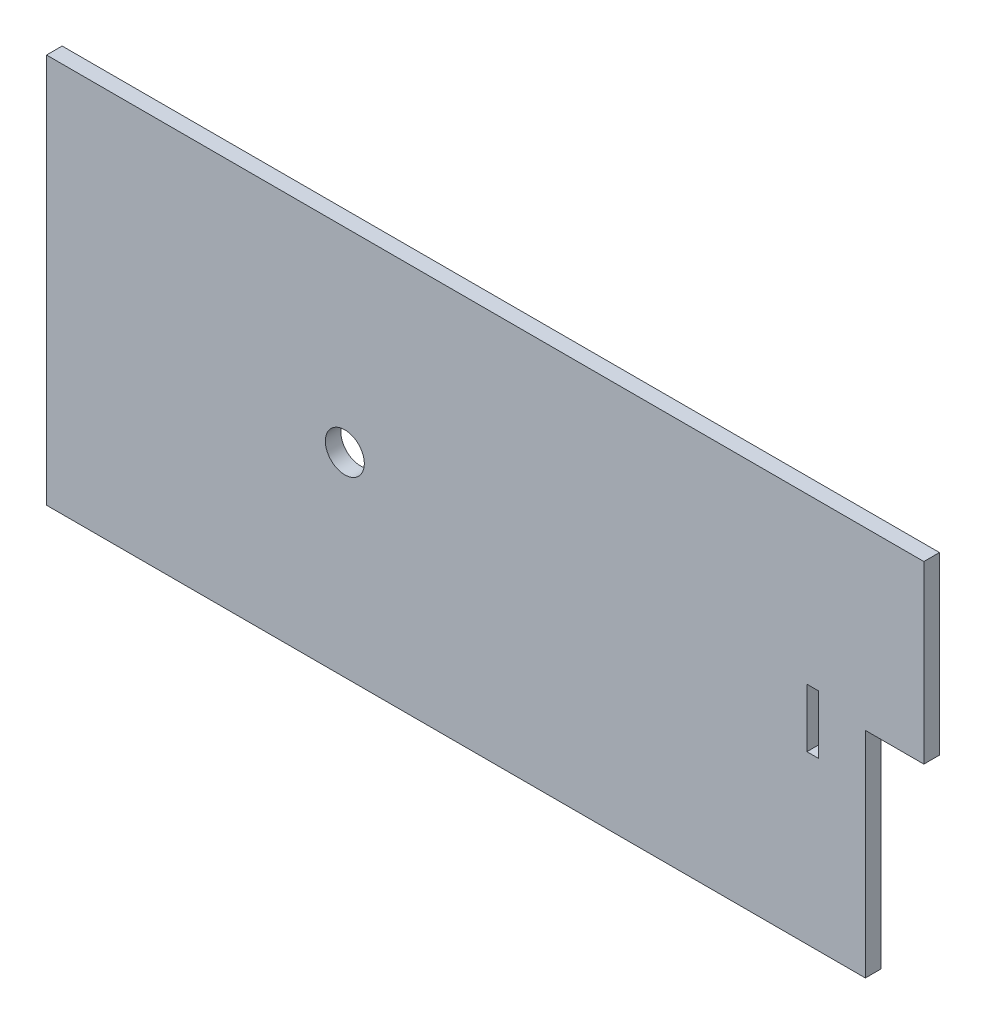
ISO-10303-21;
HEADER;
FILE_DESCRIPTION(('STEP AP214'),'2;1');
FILE_NAME('part.step','',(''),(''),'','','');
FILE_SCHEMA(('AUTOMOTIVE_DESIGN { 1 0 10303 214 1 1 1 1 }'));
ENDSEC;
DATA;
#1=APPLICATION_CONTEXT('core data for automotive mechanical design processes');
#2=APPLICATION_PROTOCOL_DEFINITION('international standard','automotive_design',2000,#1);
#3=PRODUCT_CONTEXT('',#1,'mechanical');
#4=PRODUCT('Part','Part','',(#3));
#5=PRODUCT_RELATED_PRODUCT_CATEGORY('part','',(#4));
#6=PRODUCT_DEFINITION_FORMATION('','',#4);
#7=PRODUCT_DEFINITION_CONTEXT('part definition',#1,'design');
#8=PRODUCT_DEFINITION('design','',#6,#7);
#9=PRODUCT_DEFINITION_SHAPE('','',#8);
#10=(LENGTH_UNIT() NAMED_UNIT(*) SI_UNIT(.MILLI.,.METRE.));
#11=(NAMED_UNIT(*) PLANE_ANGLE_UNIT() SI_UNIT($,.RADIAN.));
#12=(NAMED_UNIT(*) SI_UNIT($,.STERADIAN.) SOLID_ANGLE_UNIT());
#13=UNCERTAINTY_MEASURE_WITH_UNIT(LENGTH_MEASURE(1.E-05),#10,'distance_accuracy_value','');
#14=(GEOMETRIC_REPRESENTATION_CONTEXT(3) GLOBAL_UNCERTAINTY_ASSIGNED_CONTEXT((#13)) GLOBAL_UNIT_ASSIGNED_CONTEXT((#10,
#11,#12)) REPRESENTATION_CONTEXT('',''));
#15=CARTESIAN_POINT('',(0.,0.,0.));
#16=DIRECTION('',(0.,0.,1.));
#17=DIRECTION('',(1.,0.,0.));
#18=AXIS2_PLACEMENT_3D('',#15,#16,#17);
#19=CARTESIAN_POINT('',(0.,0.,4.));
#20=DIRECTION('',(0.,0.,-1.));
#21=DIRECTION('',(-1.,0.,0.));
#22=AXIS2_PLACEMENT_3D('',#19,#20,#21);
#23=PLANE('',#22);
#24=DIRECTION('',(-1.,0.,0.));
#25=VECTOR('',#24,1.);
#26=CARTESIAN_POINT('',(-150.,50.,4.));
#27=LINE('',#26,#25);
#28=CARTESIAN_POINT('',(75.,50.,4.));
#29=VERTEX_POINT('',#28);
#30=CARTESIAN_POINT('',(-150.,50.,4.));
#31=VERTEX_POINT('',#30);
#32=EDGE_CURVE('E149',#29,#31,#27,.T.);
#33=ORIENTED_EDGE('',*,*,#32,.T.);
#34=DIRECTION('',(0.,-1.,0.));
#35=VECTOR('',#34,1.);
#36=CARTESIAN_POINT('',(-150.,-50.,4.));
#37=LINE('',#36,#35);
#38=CARTESIAN_POINT('',(-150.,-50.,4.));
#39=VERTEX_POINT('',#38);
#40=EDGE_CURVE('E152',#31,#39,#37,.T.);
#41=ORIENTED_EDGE('',*,*,#40,.T.);
#42=DIRECTION('',(1.,0.,0.));
#43=VECTOR('',#42,1.);
#44=CARTESIAN_POINT('',(-150.,-50.,4.));
#45=LINE('',#44,#43);
#46=CARTESIAN_POINT('',(60.,-50.,4.));
#47=VERTEX_POINT('',#46);
#48=EDGE_CURVE('E155',#39,#47,#45,.T.);
#49=ORIENTED_EDGE('',*,*,#48,.T.);
#50=DIRECTION('',(0.,1.,0.));
#51=VECTOR('',#50,1.);
#52=CARTESIAN_POINT('',(60.,5.,4.));
#53=LINE('',#52,#51);
#54=CARTESIAN_POINT('',(60.,5.,4.));
#55=VERTEX_POINT('',#54);
#56=EDGE_CURVE('E157',#47,#55,#53,.T.);
#57=ORIENTED_EDGE('',*,*,#56,.T.);
#58=DIRECTION('',(1.,0.,0.));
#59=VECTOR('',#58,1.);
#60=CARTESIAN_POINT('',(75.,5.,4.));
#61=LINE('',#60,#59);
#62=CARTESIAN_POINT('',(75.,5.,4.));
#63=VERTEX_POINT('',#62);
#64=EDGE_CURVE('E159',#55,#63,#61,.T.);
#65=ORIENTED_EDGE('',*,*,#64,.T.);
#66=DIRECTION('',(0.,1.,0.));
#67=VECTOR('',#66,1.);
#68=CARTESIAN_POINT('',(75.,50.,4.));
#69=LINE('',#68,#67);
#70=EDGE_CURVE('E161',#63,#29,#69,.T.);
#71=ORIENTED_EDGE('',*,*,#70,.T.);
#72=EDGE_LOOP('',(#33,#41,#49,#57,#65,#71));
#73=FACE_BOUND('',#72,.T.);
#74=DIRECTION('',(0.,1.,0.));
#75=VECTOR('',#74,1.);
#76=CARTESIAN_POINT('',(48.,7.76206531965649,4.));
#77=LINE('',#76,#75);
#78=CARTESIAN_POINT('',(48.,-7.23793468034351,4.));
#79=VERTEX_POINT('',#78);
#80=CARTESIAN_POINT('',(48.,7.76206531965649,4.));
#81=VERTEX_POINT('',#80);
#82=EDGE_CURVE('E110',#79,#81,#77,.T.);
#83=ORIENTED_EDGE('',*,*,#82,.F.);
#84=DIRECTION('',(1.,0.,0.));
#85=VECTOR('',#84,1.);
#86=CARTESIAN_POINT('',(45.,-7.23793468034351,4.));
#87=LINE('',#86,#85);
#88=CARTESIAN_POINT('',(45.,-7.23793468034351,4.));
#89=VERTEX_POINT('',#88);
#90=EDGE_CURVE('E133',#89,#79,#87,.T.);
#91=ORIENTED_EDGE('',*,*,#90,.F.);
#92=DIRECTION('',(0.,-1.,0.));
#93=VECTOR('',#92,1.);
#94=CARTESIAN_POINT('',(45.,7.76206531965649,4.));
#95=LINE('',#94,#93);
#96=CARTESIAN_POINT('',(45.,7.76206531965649,4.));
#97=VERTEX_POINT('',#96);
#98=EDGE_CURVE('E131',#97,#89,#95,.T.);
#99=ORIENTED_EDGE('',*,*,#98,.F.);
#100=DIRECTION('',(-1.,0.,0.));
#101=VECTOR('',#100,1.);
#102=CARTESIAN_POINT('',(45.,7.76206531965649,4.));
#103=LINE('',#102,#101);
#104=EDGE_CURVE('E118',#81,#97,#103,.T.);
#105=ORIENTED_EDGE('',*,*,#104,.F.);
#106=EDGE_LOOP('',(#83,#91,#99,#105));
#107=FACE_BOUND('',#106,.T.);
#108=CARTESIAN_POINT('',(-73.5,0.,4.));
#109=DIRECTION('',(0.,0.,1.));
#110=DIRECTION('',(1.,0.,0.));
#111=AXIS2_PLACEMENT_3D('',#108,#109,#110);
#112=CIRCLE('',#111,5.);
#113=CARTESIAN_POINT('',(-68.5,0.,4.));
#114=VERTEX_POINT('',#113);
#115=EDGE_CURVE('E139',#114,#114,#112,.T.);
#116=ORIENTED_EDGE('',*,*,#115,.F.);
#117=EDGE_LOOP('',(#116));
#118=FACE_BOUND('',#117,.T.);
#119=ADVANCED_FACE('F33',(#73,#107,#118),#23,.F.);
#120=CARTESIAN_POINT('',(0.,0.,0.));
#121=DIRECTION('',(0.,0.,-1.));
#122=DIRECTION('',(-1.,0.,0.));
#123=AXIS2_PLACEMENT_3D('',#120,#121,#122);
#124=PLANE('',#123);
#125=DIRECTION('',(1.,0.,0.));
#126=VECTOR('',#125,1.);
#127=CARTESIAN_POINT('',(45.,-7.23793468034351,0.));
#128=LINE('',#127,#126);
#129=CARTESIAN_POINT('',(45.,-7.23793468034351,0.));
#130=VERTEX_POINT('',#129);
#131=CARTESIAN_POINT('',(48.,-7.23793468034351,0.));
#132=VERTEX_POINT('',#131);
#133=EDGE_CURVE('E119',#130,#132,#128,.T.);
#134=ORIENTED_EDGE('',*,*,#133,.T.);
#135=DIRECTION('',(0.,1.,0.));
#136=VECTOR('',#135,1.);
#137=CARTESIAN_POINT('',(48.,7.76206531965649,0.));
#138=LINE('',#137,#136);
#139=CARTESIAN_POINT('',(48.,7.76206531965649,0.));
#140=VERTEX_POINT('',#139);
#141=EDGE_CURVE('E56',#132,#140,#138,.T.);
#142=ORIENTED_EDGE('',*,*,#141,.T.);
#143=DIRECTION('',(-1.,0.,0.));
#144=VECTOR('',#143,1.);
#145=CARTESIAN_POINT('',(45.,7.76206531965649,0.));
#146=LINE('',#145,#144);
#147=CARTESIAN_POINT('',(45.,7.76206531965649,0.));
#148=VERTEX_POINT('',#147);
#149=EDGE_CURVE('E125',#140,#148,#146,.T.);
#150=ORIENTED_EDGE('',*,*,#149,.T.);
#151=DIRECTION('',(0.,-1.,0.));
#152=VECTOR('',#151,1.);
#153=CARTESIAN_POINT('',(45.,7.76206531965649,0.));
#154=LINE('',#153,#152);
#155=EDGE_CURVE('E141',#148,#130,#154,.T.);
#156=ORIENTED_EDGE('',*,*,#155,.T.);
#157=EDGE_LOOP('',(#134,#142,#150,#156));
#158=FACE_BOUND('',#157,.T.);
#159=DIRECTION('',(0.,-1.,0.));
#160=VECTOR('',#159,1.);
#161=CARTESIAN_POINT('',(-150.,-50.,0.));
#162=LINE('',#161,#160);
#163=CARTESIAN_POINT('',(-150.,50.,0.));
#164=VERTEX_POINT('',#163);
#165=CARTESIAN_POINT('',(-150.,-50.,0.));
#166=VERTEX_POINT('',#165);
#167=EDGE_CURVE('E126',#164,#166,#162,.T.);
#168=ORIENTED_EDGE('',*,*,#167,.F.);
#169=DIRECTION('',(-1.,0.,0.));
#170=VECTOR('',#169,1.);
#171=CARTESIAN_POINT('',(60.,50.,0.));
#172=LINE('',#171,#170);
#173=CARTESIAN_POINT('',(75.,50.,0.));
#174=VERTEX_POINT('',#173);
#175=EDGE_CURVE('E153',#174,#164,#172,.T.);
#176=ORIENTED_EDGE('',*,*,#175,.F.);
#177=DIRECTION('',(0.,1.,0.));
#178=VECTOR('',#177,1.);
#179=CARTESIAN_POINT('',(75.,50.,0.));
#180=LINE('',#179,#178);
#181=CARTESIAN_POINT('',(75.,5.,0.));
#182=VERTEX_POINT('',#181);
#183=EDGE_CURVE('E172',#182,#174,#180,.T.);
#184=ORIENTED_EDGE('',*,*,#183,.F.);
#185=DIRECTION('',(1.,0.,0.));
#186=VECTOR('',#185,1.);
#187=CARTESIAN_POINT('',(75.,5.,0.));
#188=LINE('',#187,#186);
#189=CARTESIAN_POINT('',(60.,5.,0.));
#190=VERTEX_POINT('',#189);
#191=EDGE_CURVE('E170',#190,#182,#188,.T.);
#192=ORIENTED_EDGE('',*,*,#191,.F.);
#193=DIRECTION('',(0.,1.,0.));
#194=VECTOR('',#193,1.);
#195=CARTESIAN_POINT('',(60.,5.,0.));
#196=LINE('',#195,#194);
#197=CARTESIAN_POINT('',(60.,-50.,0.));
#198=VERTEX_POINT('',#197);
#199=EDGE_CURVE('E168',#198,#190,#196,.T.);
#200=ORIENTED_EDGE('',*,*,#199,.F.);
#201=DIRECTION('',(1.,0.,0.));
#202=VECTOR('',#201,1.);
#203=CARTESIAN_POINT('',(-150.,-50.,0.));
#204=LINE('',#203,#202);
#205=EDGE_CURVE('E166',#166,#198,#204,.T.);
#206=ORIENTED_EDGE('',*,*,#205,.F.);
#207=EDGE_LOOP('',(#168,#176,#184,#192,#200,#206));
#208=FACE_BOUND('',#207,.T.);
#209=CARTESIAN_POINT('',(-73.5,0.,0.));
#210=DIRECTION('',(0.,0.,1.));
#211=DIRECTION('',(1.,0.,0.));
#212=AXIS2_PLACEMENT_3D('',#209,#210,#211);
#213=CIRCLE('',#212,5.);
#214=CARTESIAN_POINT('',(-68.5,0.,0.));
#215=VERTEX_POINT('',#214);
#216=EDGE_CURVE('E254',#215,#215,#213,.T.);
#217=ORIENTED_EDGE('',*,*,#216,.T.);
#218=EDGE_LOOP('',(#217));
#219=FACE_BOUND('',#218,.T.);
#220=ADVANCED_FACE('F196',(#158,#208,#219),#124,.T.);
#221=CARTESIAN_POINT('',(-150.,-50.,4.));
#222=DIRECTION('',(1.,0.,0.));
#223=DIRECTION('',(0.,0.,-1.));
#224=AXIS2_PLACEMENT_3D('',#221,#222,#223);
#225=PLANE('',#224);
#226=ORIENTED_EDGE('',*,*,#167,.T.);
#227=DIRECTION('',(0.,0.,-1.));
#228=VECTOR('',#227,1.);
#229=CARTESIAN_POINT('',(-150.,-50.,4.));
#230=LINE('',#229,#228);
#231=EDGE_CURVE('E41',#39,#166,#230,.T.);
#232=ORIENTED_EDGE('',*,*,#231,.F.);
#233=ORIENTED_EDGE('',*,*,#40,.F.);
#234=DIRECTION('',(0.,0.,-1.));
#235=VECTOR('',#234,1.);
#236=CARTESIAN_POINT('',(-150.,50.,4.));
#237=LINE('',#236,#235);
#238=EDGE_CURVE('E11',#31,#164,#237,.T.);
#239=ORIENTED_EDGE('',*,*,#238,.T.);
#240=EDGE_LOOP('',(#226,#232,#233,#239));
#241=FACE_BOUND('',#240,.T.);
#242=ADVANCED_FACE('F35',(#241),#225,.F.);
#243=CARTESIAN_POINT('',(-150.,-50.,4.));
#244=DIRECTION('',(0.,1.,0.));
#245=DIRECTION('',(0.,0.,1.));
#246=AXIS2_PLACEMENT_3D('',#243,#244,#245);
#247=PLANE('',#246);
#248=ORIENTED_EDGE('',*,*,#205,.T.);
#249=DIRECTION('',(0.,0.,-1.));
#250=VECTOR('',#249,1.);
#251=CARTESIAN_POINT('',(60.,-50.,4.));
#252=LINE('',#251,#250);
#253=EDGE_CURVE('E183',#47,#198,#252,.T.);
#254=ORIENTED_EDGE('',*,*,#253,.F.);
#255=ORIENTED_EDGE('',*,*,#48,.F.);
#256=ORIENTED_EDGE('',*,*,#231,.T.);
#257=EDGE_LOOP('',(#248,#254,#255,#256));
#258=FACE_BOUND('',#257,.T.);
#259=ADVANCED_FACE('F190',(#258),#247,.F.);
#260=CARTESIAN_POINT('',(60.,5.,4.));
#261=DIRECTION('',(-1.,0.,0.));
#262=DIRECTION('',(0.,0.,1.));
#263=AXIS2_PLACEMENT_3D('',#260,#261,#262);
#264=PLANE('',#263);
#265=ORIENTED_EDGE('',*,*,#199,.T.);
#266=DIRECTION('',(0.,0.,-1.));
#267=VECTOR('',#266,1.);
#268=CARTESIAN_POINT('',(60.,5.,4.));
#269=LINE('',#268,#267);
#270=EDGE_CURVE('E180',#55,#190,#269,.T.);
#271=ORIENTED_EDGE('',*,*,#270,.F.);
#272=ORIENTED_EDGE('',*,*,#56,.F.);
#273=ORIENTED_EDGE('',*,*,#253,.T.);
#274=EDGE_LOOP('',(#265,#271,#272,#273));
#275=FACE_BOUND('',#274,.T.);
#276=ADVANCED_FACE('F203',(#275),#264,.F.);
#277=CARTESIAN_POINT('',(75.,5.,4.));
#278=DIRECTION('',(0.,1.,0.));
#279=DIRECTION('',(-1.,0.,0.));
#280=AXIS2_PLACEMENT_3D('',#277,#278,#279);
#281=PLANE('',#280);
#282=ORIENTED_EDGE('',*,*,#191,.T.);
#283=DIRECTION('',(0.,0.,-1.));
#284=VECTOR('',#283,1.);
#285=CARTESIAN_POINT('',(75.,5.,4.));
#286=LINE('',#285,#284);
#287=EDGE_CURVE('E177',#63,#182,#286,.T.);
#288=ORIENTED_EDGE('',*,*,#287,.F.);
#289=ORIENTED_EDGE('',*,*,#64,.F.);
#290=ORIENTED_EDGE('',*,*,#270,.T.);
#291=EDGE_LOOP('',(#282,#288,#289,#290));
#292=FACE_BOUND('',#291,.T.);
#293=ADVANCED_FACE('F207',(#292),#281,.F.);
#294=CARTESIAN_POINT('',(75.,50.,4.));
#295=DIRECTION('',(-1.,0.,0.));
#296=DIRECTION('',(0.,-1.,0.));
#297=AXIS2_PLACEMENT_3D('',#294,#295,#296);
#298=PLANE('',#297);
#299=ORIENTED_EDGE('',*,*,#183,.T.);
#300=DIRECTION('',(0.,0.,-1.));
#301=VECTOR('',#300,1.);
#302=CARTESIAN_POINT('',(75.,50.,4.));
#303=LINE('',#302,#301);
#304=EDGE_CURVE('E164',#29,#174,#303,.T.);
#305=ORIENTED_EDGE('',*,*,#304,.F.);
#306=ORIENTED_EDGE('',*,*,#70,.F.);
#307=ORIENTED_EDGE('',*,*,#287,.T.);
#308=EDGE_LOOP('',(#299,#305,#306,#307));
#309=FACE_BOUND('',#308,.T.);
#310=ADVANCED_FACE('F216',(#309),#298,.F.);
#311=CARTESIAN_POINT('',(60.,50.,4.));
#312=DIRECTION('',(0.,-1.,0.));
#313=DIRECTION('',(0.,0.,-1.));
#314=AXIS2_PLACEMENT_3D('',#311,#312,#313);
#315=PLANE('',#314);
#316=ORIENTED_EDGE('',*,*,#175,.T.);
#317=ORIENTED_EDGE('',*,*,#238,.F.);
#318=ORIENTED_EDGE('',*,*,#32,.F.);
#319=ORIENTED_EDGE('',*,*,#304,.T.);
#320=EDGE_LOOP('',(#316,#317,#318,#319));
#321=FACE_BOUND('',#320,.T.);
#322=ADVANCED_FACE('F214',(#321),#315,.F.);
#323=CARTESIAN_POINT('',(48.,7.76206531965649,4.));
#324=DIRECTION('',(-1.,0.,0.));
#325=DIRECTION('',(0.,-1.,0.));
#326=AXIS2_PLACEMENT_3D('',#323,#324,#325);
#327=PLANE('',#326);
#328=ORIENTED_EDGE('',*,*,#141,.F.);
#329=DIRECTION('',(0.,0.,-1.));
#330=VECTOR('',#329,1.);
#331=CARTESIAN_POINT('',(48.,-7.23793468034351,4.));
#332=LINE('',#331,#330);
#333=EDGE_CURVE('E114',#79,#132,#332,.T.);
#334=ORIENTED_EDGE('',*,*,#333,.F.);
#335=ORIENTED_EDGE('',*,*,#82,.T.);
#336=DIRECTION('',(0.,0.,-1.));
#337=VECTOR('',#336,1.);
#338=CARTESIAN_POINT('',(48.,7.76206531965649,4.));
#339=LINE('',#338,#337);
#340=EDGE_CURVE('E113',#81,#140,#339,.T.);
#341=ORIENTED_EDGE('',*,*,#340,.T.);
#342=EDGE_LOOP('',(#328,#334,#335,#341));
#343=FACE_BOUND('',#342,.T.);
#344=ADVANCED_FACE('F112',(#343),#327,.T.);
#345=CARTESIAN_POINT('',(45.,7.76206531965649,4.));
#346=DIRECTION('',(0.,-1.,0.));
#347=DIRECTION('',(0.,0.,-1.));
#348=AXIS2_PLACEMENT_3D('',#345,#346,#347);
#349=PLANE('',#348);
#350=ORIENTED_EDGE('',*,*,#149,.F.);
#351=ORIENTED_EDGE('',*,*,#340,.F.);
#352=ORIENTED_EDGE('',*,*,#104,.T.);
#353=DIRECTION('',(0.,0.,-1.));
#354=VECTOR('',#353,1.);
#355=CARTESIAN_POINT('',(45.,7.76206531965649,4.));
#356=LINE('',#355,#354);
#357=EDGE_CURVE('E127',#97,#148,#356,.T.);
#358=ORIENTED_EDGE('',*,*,#357,.T.);
#359=EDGE_LOOP('',(#350,#351,#352,#358));
#360=FACE_BOUND('',#359,.T.);
#361=ADVANCED_FACE('F122',(#360),#349,.T.);
#362=CARTESIAN_POINT('',(45.,7.76206531965649,4.));
#363=DIRECTION('',(1.,0.,0.));
#364=DIRECTION('',(0.,0.,-1.));
#365=AXIS2_PLACEMENT_3D('',#362,#363,#364);
#366=PLANE('',#365);
#367=ORIENTED_EDGE('',*,*,#155,.F.);
#368=ORIENTED_EDGE('',*,*,#357,.F.);
#369=ORIENTED_EDGE('',*,*,#98,.T.);
#370=DIRECTION('',(0.,0.,-1.));
#371=VECTOR('',#370,1.);
#372=CARTESIAN_POINT('',(45.,-7.23793468034351,4.));
#373=LINE('',#372,#371);
#374=EDGE_CURVE('E48',#89,#130,#373,.T.);
#375=ORIENTED_EDGE('',*,*,#374,.T.);
#376=EDGE_LOOP('',(#367,#368,#369,#375));
#377=FACE_BOUND('',#376,.T.);
#378=ADVANCED_FACE('F237',(#377),#366,.T.);
#379=CARTESIAN_POINT('',(45.,-7.23793468034351,4.));
#380=DIRECTION('',(0.,1.,0.));
#381=DIRECTION('',(0.,0.,1.));
#382=AXIS2_PLACEMENT_3D('',#379,#380,#381);
#383=PLANE('',#382);
#384=ORIENTED_EDGE('',*,*,#133,.F.);
#385=ORIENTED_EDGE('',*,*,#374,.F.);
#386=ORIENTED_EDGE('',*,*,#90,.T.);
#387=ORIENTED_EDGE('',*,*,#333,.T.);
#388=EDGE_LOOP('',(#384,#385,#386,#387));
#389=FACE_BOUND('',#388,.T.);
#390=ADVANCED_FACE('F240',(#389),#383,.T.);
#391=CARTESIAN_POINT('',(-73.5,0.,4.));
#392=DIRECTION('',(0.,0.,-1.));
#393=DIRECTION('',(-1.,0.,0.));
#394=AXIS2_PLACEMENT_3D('',#391,#392,#393);
#395=CYLINDRICAL_SURFACE('',#394,5.);
#396=ORIENTED_EDGE('',*,*,#115,.T.);
#397=EDGE_LOOP('',(#396));
#398=FACE_BOUND('',#397,.T.);
#399=ORIENTED_EDGE('',*,*,#216,.F.);
#400=EDGE_LOOP('',(#399));
#401=FACE_BOUND('',#400,.T.);
#402=ADVANCED_FACE('F244',(#398,#401),#395,.F.);
#403=CLOSED_SHELL('',(#119,#220,#242,#259,#276,#293,#310,#322,#344,#361,#378,#390,#402));
#404=MANIFOLD_SOLID_BREP('B2',#403);
#405=ADVANCED_BREP_SHAPE_REPRESENTATION('',(#18,#404),#14);
#406=SHAPE_DEFINITION_REPRESENTATION(#9,#405);
ENDSEC;
END-ISO-10303-21;
